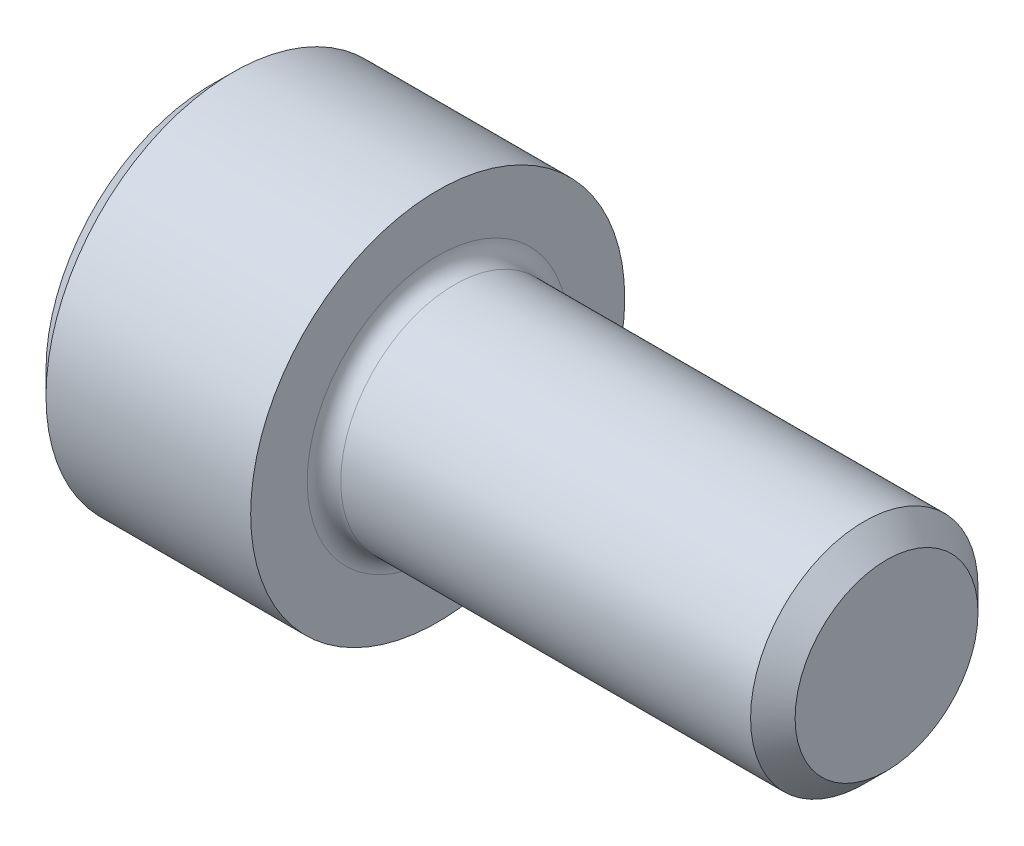
ISO-10303-21;
HEADER;
FILE_DESCRIPTION(('STEP AP214'),'2;1');
FILE_NAME('part.step','',(''),(''),'','','');
FILE_SCHEMA(('AUTOMOTIVE_DESIGN { 1 0 10303 214 1 1 1 1 }'));
ENDSEC;
DATA;
#1=APPLICATION_CONTEXT('core data for automotive mechanical design processes');
#2=APPLICATION_PROTOCOL_DEFINITION('international standard','automotive_design',2000,#1);
#3=PRODUCT_CONTEXT('',#1,'mechanical');
#4=PRODUCT('Part','Part','',(#3));
#5=PRODUCT_RELATED_PRODUCT_CATEGORY('part','',(#4));
#6=PRODUCT_DEFINITION_FORMATION('','',#4);
#7=PRODUCT_DEFINITION_CONTEXT('part definition',#1,'design');
#8=PRODUCT_DEFINITION('design','',#6,#7);
#9=PRODUCT_DEFINITION_SHAPE('','',#8);
#10=(LENGTH_UNIT() NAMED_UNIT(*) SI_UNIT(.MILLI.,.METRE.));
#11=(NAMED_UNIT(*) PLANE_ANGLE_UNIT() SI_UNIT($,.RADIAN.));
#12=(NAMED_UNIT(*) SI_UNIT($,.STERADIAN.) SOLID_ANGLE_UNIT());
#13=UNCERTAINTY_MEASURE_WITH_UNIT(LENGTH_MEASURE(1.E-05),#10,'distance_accuracy_value','');
#14=(GEOMETRIC_REPRESENTATION_CONTEXT(3) GLOBAL_UNCERTAINTY_ASSIGNED_CONTEXT((#13)) GLOBAL_UNIT_ASSIGNED_CONTEXT((#10,
#11,#12)) REPRESENTATION_CONTEXT('',''));
#15=CARTESIAN_POINT('',(0.,0.,0.));
#16=DIRECTION('',(0.,0.,1.));
#17=DIRECTION('',(1.,0.,0.));
#18=AXIS2_PLACEMENT_3D('',#15,#16,#17);
#19=CARTESIAN_POINT('',(0.,0.,0.));
#20=DIRECTION('',(-1.,0.,0.));
#21=DIRECTION('',(0.,0.,1.));
#22=AXIS2_PLACEMENT_3D('',#19,#20,#21);
#23=PLANE('',#22);
#24=DIRECTION('',(0.,-0.499999999999998,0.86602540378444));
#25=VECTOR('',#24,1.);
#26=CARTESIAN_POINT('',(0.,2.2920921156882,0.));
#27=LINE('',#26,#25);
#28=CARTESIAN_POINT('',(0.,2.2920921156882,0.));
#29=VERTEX_POINT('',#28);
#30=CARTESIAN_POINT('',(0.,1.14604605784411,1.98501));
#31=VERTEX_POINT('',#30);
#32=EDGE_CURVE('E264',#29,#31,#27,.T.);
#33=ORIENTED_EDGE('',*,*,#32,.T.);
#34=DIRECTION('',(0.,1.,0.));
#35=VECTOR('',#34,1.);
#36=CARTESIAN_POINT('',(0.,-1.14604605784409,1.98501));
#37=LINE('',#36,#35);
#38=CARTESIAN_POINT('',(0.,-1.14604605784409,1.98501));
#39=VERTEX_POINT('',#38);
#40=EDGE_CURVE('E124',#39,#31,#37,.T.);
#41=ORIENTED_EDGE('',*,*,#40,.F.);
#42=DIRECTION('',(0.,-0.500000000000001,-0.866025403784438));
#43=VECTOR('',#42,1.);
#44=CARTESIAN_POINT('',(0.,-1.14604605784409,1.98501));
#45=LINE('',#44,#43);
#46=CARTESIAN_POINT('',(0.,-2.29209211568819,0.));
#47=VERTEX_POINT('',#46);
#48=EDGE_CURVE('E267',#39,#47,#45,.T.);
#49=ORIENTED_EDGE('',*,*,#48,.T.);
#50=DIRECTION('',(0.,0.499999999999999,-0.86602540378444));
#51=VECTOR('',#50,1.);
#52=CARTESIAN_POINT('',(0.,-2.29209211568819,0.));
#53=LINE('',#52,#51);
#54=CARTESIAN_POINT('',(0.,-1.1460460578441,-1.98501));
#55=VERTEX_POINT('',#54);
#56=EDGE_CURVE('E270',#47,#55,#53,.T.);
#57=ORIENTED_EDGE('',*,*,#56,.T.);
#58=DIRECTION('',(0.,-1.,0.));
#59=VECTOR('',#58,1.);
#60=CARTESIAN_POINT('',(0.,1.1460460578441,-1.98501));
#61=LINE('',#60,#59);
#62=CARTESIAN_POINT('',(0.,1.1460460578441,-1.98501));
#63=VERTEX_POINT('',#62);
#64=EDGE_CURVE('E273',#63,#55,#61,.T.);
#65=ORIENTED_EDGE('',*,*,#64,.F.);
#66=DIRECTION('',(0.,-0.500000000000002,-0.866025403784438));
#67=VECTOR('',#66,1.);
#68=CARTESIAN_POINT('',(0.,2.2920921156882,0.));
#69=LINE('',#68,#67);
#70=EDGE_CURVE('E119',#29,#63,#69,.T.);
#71=ORIENTED_EDGE('',*,*,#70,.F.);
#72=EDGE_LOOP('',(#33,#41,#49,#57,#65,#71));
#73=FACE_BOUND('',#72,.T.);
#74=CARTESIAN_POINT('',(0.,0.,0.));
#75=DIRECTION('',(-1.,0.,0.));
#76=DIRECTION('',(0.,0.,1.));
#77=AXIS2_PLACEMENT_3D('',#74,#75,#76);
#78=CIRCLE('',#77,3.48615000000001);
#79=CARTESIAN_POINT('',(0.,0.,3.48615000000001));
#80=VERTEX_POINT('',#79);
#81=EDGE_CURVE('E148',#80,#80,#78,.T.);
#82=ORIENTED_EDGE('',*,*,#81,.T.);
#83=EDGE_LOOP('',(#82));
#84=FACE_BOUND('',#83,.T.);
#85=ADVANCED_FACE('F32',(#73,#84),#23,.T.);
#86=CARTESIAN_POINT('',(0.,0.,0.));
#87=DIRECTION('',(1.,0.,0.));
#88=DIRECTION('',(0.,0.,-1.));
#89=AXIS2_PLACEMENT_3D('',#86,#87,#88);
#90=CONICAL_SURFACE('',#89,3.48615000000001,0.785398163397439);
#91=CARTESIAN_POINT('',(0.4826,0.,0.));
#92=DIRECTION('',(-1.,0.,0.));
#93=DIRECTION('',(0.,0.,1.));
#94=AXIS2_PLACEMENT_3D('',#91,#92,#93);
#95=CIRCLE('',#94,3.96875);
#96=CARTESIAN_POINT('',(0.4826,0.,3.96875));
#97=VERTEX_POINT('',#96);
#98=EDGE_CURVE('E145',#97,#97,#95,.T.);
#99=ORIENTED_EDGE('',*,*,#98,.T.);
#100=EDGE_LOOP('',(#99));
#101=FACE_BOUND('',#100,.T.);
#102=ORIENTED_EDGE('',*,*,#81,.F.);
#103=EDGE_LOOP('',(#102));
#104=FACE_BOUND('',#103,.T.);
#105=ADVANCED_FACE('F169',(#101,#104),#90,.T.);
#106=CARTESIAN_POINT('',(-31.75,0.,0.));
#107=DIRECTION('',(-1.,0.,0.));
#108=DIRECTION('',(0.,0.,1.));
#109=AXIS2_PLACEMENT_3D('',#106,#107,#108);
#110=CYLINDRICAL_SURFACE('',#109,3.96875);
#111=CARTESIAN_POINT('',(4.826,0.,0.));
#112=DIRECTION('',(-1.,0.,0.));
#113=DIRECTION('',(0.,0.,1.));
#114=AXIS2_PLACEMENT_3D('',#111,#112,#113);
#115=CIRCLE('',#114,3.96875);
#116=CARTESIAN_POINT('',(4.826,0.,3.96875));
#117=VERTEX_POINT('',#116);
#118=EDGE_CURVE('E142',#117,#117,#115,.T.);
#119=ORIENTED_EDGE('',*,*,#118,.T.);
#120=EDGE_LOOP('',(#119));
#121=FACE_BOUND('',#120,.T.);
#122=ORIENTED_EDGE('',*,*,#98,.F.);
#123=EDGE_LOOP('',(#122));
#124=FACE_BOUND('',#123,.T.);
#125=ADVANCED_FACE('F174',(#121,#124),#110,.T.);
#126=CARTESIAN_POINT('',(4.826,3.96875,0.));
#127=DIRECTION('',(1.,0.,0.));
#128=DIRECTION('',(0.,0.,-1.));
#129=AXIS2_PLACEMENT_3D('',#126,#127,#128);
#130=PLANE('',#129);
#131=CARTESIAN_POINT('',(4.826,0.,0.));
#132=DIRECTION('',(1.,0.,0.));
#133=DIRECTION('',(0.,0.,-1.));
#134=AXIS2_PLACEMENT_3D('',#131,#132,#133);
#135=CIRCLE('',#134,2.7686);
#136=CARTESIAN_POINT('',(4.826,0.,-2.7686));
#137=VERTEX_POINT('',#136);
#138=EDGE_CURVE('E40',#137,#137,#135,.F.);
#139=ORIENTED_EDGE('',*,*,#138,.T.);
#140=EDGE_LOOP('',(#139));
#141=FACE_BOUND('',#140,.T.);
#142=ORIENTED_EDGE('',*,*,#118,.F.);
#143=EDGE_LOOP('',(#142));
#144=FACE_BOUND('',#143,.T.);
#145=ADVANCED_FACE('F153',(#141,#144),#130,.T.);
#146=CARTESIAN_POINT('',(-31.75,0.,0.));
#147=DIRECTION('',(-1.,0.,0.));
#148=DIRECTION('',(0.,0.,1.));
#149=AXIS2_PLACEMENT_3D('',#146,#147,#148);
#150=CYLINDRICAL_SURFACE('',#149,2.413);
#151=CARTESIAN_POINT('',(5.1816,0.,0.));
#152=DIRECTION('',(1.,0.,0.));
#153=DIRECTION('',(0.,0.,-1.));
#154=AXIS2_PLACEMENT_3D('',#151,#152,#153);
#155=CIRCLE('',#154,2.413);
#156=CARTESIAN_POINT('',(5.1816,0.,-2.413));
#157=VERTEX_POINT('',#156);
#158=EDGE_CURVE('E11',#157,#157,#155,.T.);
#159=ORIENTED_EDGE('',*,*,#158,.T.);
#160=EDGE_LOOP('',(#159));
#161=FACE_BOUND('',#160,.T.);
#162=CARTESIAN_POINT('',(13.87856,0.,0.));
#163=DIRECTION('',(-1.,0.,0.));
#164=DIRECTION('',(0.,0.,1.));
#165=AXIS2_PLACEMENT_3D('',#162,#163,#164);
#166=CIRCLE('',#165,2.413);
#167=CARTESIAN_POINT('',(13.87856,0.,2.413));
#168=VERTEX_POINT('',#167);
#169=EDGE_CURVE('E139',#168,#168,#166,.T.);
#170=ORIENTED_EDGE('',*,*,#169,.T.);
#171=EDGE_LOOP('',(#170));
#172=FACE_BOUND('',#171,.T.);
#173=ADVANCED_FACE('F184',(#161,#172),#150,.T.);
#174=CARTESIAN_POINT('',(14.351,0.,0.));
#175=DIRECTION('',(-1.,0.,0.));
#176=DIRECTION('',(0.,0.,1.));
#177=AXIS2_PLACEMENT_3D('',#174,#175,#176);
#178=CONICAL_SURFACE('',#177,1.94056,0.785398163397461);
#179=ORIENTED_EDGE('',*,*,#169,.F.);
#180=EDGE_LOOP('',(#179));
#181=FACE_BOUND('',#180,.T.);
#182=CARTESIAN_POINT('',(14.351,0.,0.));
#183=DIRECTION('',(-1.,0.,0.));
#184=DIRECTION('',(0.,0.,1.));
#185=AXIS2_PLACEMENT_3D('',#182,#183,#184);
#186=CIRCLE('',#185,1.94056);
#187=CARTESIAN_POINT('',(14.351,0.,1.94056));
#188=VERTEX_POINT('',#187);
#189=EDGE_CURVE('E135',#188,#188,#186,.T.);
#190=ORIENTED_EDGE('',*,*,#189,.T.);
#191=EDGE_LOOP('',(#190));
#192=FACE_BOUND('',#191,.T.);
#193=ADVANCED_FACE('F164',(#181,#192),#178,.T.);
#194=CARTESIAN_POINT('',(14.351,1.94056,0.));
#195=DIRECTION('',(1.,0.,0.));
#196=DIRECTION('',(0.,0.,-1.));
#197=AXIS2_PLACEMENT_3D('',#194,#195,#196);
#198=PLANE('',#197);
#199=ORIENTED_EDGE('',*,*,#189,.F.);
#200=EDGE_LOOP('',(#199));
#201=FACE_BOUND('',#200,.T.);
#202=ADVANCED_FACE('F157',(#201),#198,.T.);
#203=CARTESIAN_POINT('',(5.1816,0.,0.));
#204=DIRECTION('',(1.,0.,0.));
#205=DIRECTION('',(0.,0.,-1.));
#206=AXIS2_PLACEMENT_3D('',#203,#204,#205);
#207=TOROIDAL_SURFACE('',#206,2.7686,0.3556);
#208=ORIENTED_EDGE('',*,*,#158,.F.);
#209=EDGE_LOOP('',(#208));
#210=FACE_BOUND('',#209,.T.);
#211=ORIENTED_EDGE('',*,*,#138,.F.);
#212=EDGE_LOOP('',(#211));
#213=FACE_BOUND('',#212,.T.);
#214=ADVANCED_FACE('F34',(#210,#213),#207,.F.);
#215=CARTESIAN_POINT('',(2.286,2.2920921156882,0.));
#216=DIRECTION('',(0.,-0.866025403784439,-0.499999999999998));
#217=DIRECTION('',(0.,0.499999999999998,-0.86602540378444));
#218=AXIS2_PLACEMENT_3D('',#215,#216,#217);
#219=PLANE('',#218);
#220=ORIENTED_EDGE('',*,*,#32,.F.);
#221=DIRECTION('',(-1.,0.,0.));
#222=VECTOR('',#221,1.);
#223=CARTESIAN_POINT('',(2.286,2.2920921156882,0.));
#224=LINE('',#223,#222);
#225=CARTESIAN_POINT('',(2.286,2.2920921156882,0.));
#226=VERTEX_POINT('',#225);
#227=EDGE_CURVE('E263',#226,#29,#224,.T.);
#228=ORIENTED_EDGE('',*,*,#227,.F.);
#229=DIRECTION('',(0.,-0.499999999999998,0.86602540378444));
#230=VECTOR('',#229,1.);
#231=CARTESIAN_POINT('',(2.286,2.2920921156882,0.));
#232=LINE('',#231,#230);
#233=CARTESIAN_POINT('',(2.286,1.71906908676615,0.992504999999996));
#234=VERTEX_POINT('',#233);
#235=EDGE_CURVE('E47',#226,#234,#232,.T.);
#236=ORIENTED_EDGE('',*,*,#235,.T.);
#237=CARTESIAN_POINT('',(2.286,1.14604605784411,1.98501));
#238=VERTEX_POINT('',#237);
#239=EDGE_CURVE('E105',#234,#238,#232,.T.);
#240=ORIENTED_EDGE('',*,*,#239,.T.);
#241=DIRECTION('',(-1.,0.,0.));
#242=VECTOR('',#241,1.);
#243=CARTESIAN_POINT('',(2.286,1.14604605784411,1.98501));
#244=LINE('',#243,#242);
#245=EDGE_CURVE('E117',#238,#31,#244,.T.);
#246=ORIENTED_EDGE('',*,*,#245,.T.);
#247=EDGE_LOOP('',(#220,#228,#236,#240,#246));
#248=FACE_BOUND('',#247,.T.);
#249=ADVANCED_FACE('F116',(#248),#219,.T.);
#250=CARTESIAN_POINT('',(2.286,-1.14604605784409,1.98501));
#251=DIRECTION('',(0.,0.,1.));
#252=DIRECTION('',(0.,-1.,0.));
#253=AXIS2_PLACEMENT_3D('',#250,#251,#252);
#254=PLANE('',#253);
#255=ORIENTED_EDGE('',*,*,#40,.T.);
#256=ORIENTED_EDGE('',*,*,#245,.F.);
#257=DIRECTION('',(0.,1.,0.));
#258=VECTOR('',#257,1.);
#259=CARTESIAN_POINT('',(2.286,-1.14604605784409,1.98501));
#260=LINE('',#259,#258);
#261=CARTESIAN_POINT('',(2.286,0.,1.98501));
#262=VERTEX_POINT('',#261);
#263=EDGE_CURVE('E103',#262,#238,#260,.T.);
#264=ORIENTED_EDGE('',*,*,#263,.F.);
#265=CARTESIAN_POINT('',(2.286,-1.14604605784409,1.98501));
#266=VERTEX_POINT('',#265);
#267=EDGE_CURVE('E113',#266,#262,#260,.T.);
#268=ORIENTED_EDGE('',*,*,#267,.F.);
#269=DIRECTION('',(-1.,0.,0.));
#270=VECTOR('',#269,1.);
#271=CARTESIAN_POINT('',(2.286,-1.14604605784409,1.98501));
#272=LINE('',#271,#270);
#273=EDGE_CURVE('E126',#266,#39,#272,.T.);
#274=ORIENTED_EDGE('',*,*,#273,.T.);
#275=EDGE_LOOP('',(#255,#256,#264,#268,#274));
#276=FACE_BOUND('',#275,.T.);
#277=ADVANCED_FACE('F121',(#276),#254,.F.);
#278=CARTESIAN_POINT('',(2.286,-1.14604605784409,1.98501));
#279=DIRECTION('',(0.,0.866025403784438,-0.500000000000001));
#280=DIRECTION('',(0.,0.500000000000001,0.866025403784438));
#281=AXIS2_PLACEMENT_3D('',#278,#279,#280);
#282=PLANE('',#281);
#283=ORIENTED_EDGE('',*,*,#48,.F.);
#284=ORIENTED_EDGE('',*,*,#273,.F.);
#285=DIRECTION('',(0.,-0.500000000000001,-0.866025403784438));
#286=VECTOR('',#285,1.);
#287=CARTESIAN_POINT('',(2.286,-1.14604605784409,1.98501));
#288=LINE('',#287,#286);
#289=CARTESIAN_POINT('',(2.286,-1.71906908676614,0.992505));
#290=VERTEX_POINT('',#289);
#291=EDGE_CURVE('E244',#266,#290,#288,.T.);
#292=ORIENTED_EDGE('',*,*,#291,.T.);
#293=CARTESIAN_POINT('',(2.286,-2.29209211568819,0.));
#294=VERTEX_POINT('',#293);
#295=EDGE_CURVE('E246',#290,#294,#288,.T.);
#296=ORIENTED_EDGE('',*,*,#295,.T.);
#297=DIRECTION('',(-1.,0.,0.));
#298=VECTOR('',#297,1.);
#299=CARTESIAN_POINT('',(2.286,-2.29209211568819,0.));
#300=LINE('',#299,#298);
#301=EDGE_CURVE('E131',#294,#47,#300,.T.);
#302=ORIENTED_EDGE('',*,*,#301,.T.);
#303=EDGE_LOOP('',(#283,#284,#292,#296,#302));
#304=FACE_BOUND('',#303,.T.);
#305=ADVANCED_FACE('F196',(#304),#282,.T.);
#306=CARTESIAN_POINT('',(2.286,-2.29209211568819,0.));
#307=DIRECTION('',(0.,0.866025403784439,0.499999999999999));
#308=DIRECTION('',(0.,-0.499999999999999,0.866025403784439));
#309=AXIS2_PLACEMENT_3D('',#306,#307,#308);
#310=PLANE('',#309);
#311=ORIENTED_EDGE('',*,*,#56,.F.);
#312=ORIENTED_EDGE('',*,*,#301,.F.);
#313=DIRECTION('',(0.,0.499999999999999,-0.86602540378444));
#314=VECTOR('',#313,1.);
#315=CARTESIAN_POINT('',(2.286,-2.29209211568819,0.));
#316=LINE('',#315,#314);
#317=CARTESIAN_POINT('',(2.286,-1.71906908676615,-0.992504999999996));
#318=VERTEX_POINT('',#317);
#319=EDGE_CURVE('E249',#294,#318,#316,.T.);
#320=ORIENTED_EDGE('',*,*,#319,.T.);
#321=CARTESIAN_POINT('',(2.286,-1.1460460578441,-1.98501));
#322=VERTEX_POINT('',#321);
#323=EDGE_CURVE('E253',#318,#322,#316,.T.);
#324=ORIENTED_EDGE('',*,*,#323,.T.);
#325=DIRECTION('',(-1.,0.,0.));
#326=VECTOR('',#325,1.);
#327=CARTESIAN_POINT('',(2.286,-1.1460460578441,-1.98501));
#328=LINE('',#327,#326);
#329=EDGE_CURVE('E282',#322,#55,#328,.T.);
#330=ORIENTED_EDGE('',*,*,#329,.T.);
#331=EDGE_LOOP('',(#311,#312,#320,#324,#330));
#332=FACE_BOUND('',#331,.T.);
#333=ADVANCED_FACE('F199',(#332),#310,.T.);
#334=CARTESIAN_POINT('',(2.286,1.1460460578441,-1.98501));
#335=DIRECTION('',(0.,0.,-1.));
#336=DIRECTION('',(0.,1.,0.));
#337=AXIS2_PLACEMENT_3D('',#334,#335,#336);
#338=PLANE('',#337);
#339=ORIENTED_EDGE('',*,*,#64,.T.);
#340=ORIENTED_EDGE('',*,*,#329,.F.);
#341=DIRECTION('',(0.,-1.,0.));
#342=VECTOR('',#341,1.);
#343=CARTESIAN_POINT('',(2.286,1.1460460578441,-1.98501));
#344=LINE('',#343,#342);
#345=CARTESIAN_POINT('',(2.286,0.,-1.98501));
#346=VERTEX_POINT('',#345);
#347=EDGE_CURVE('E257',#346,#322,#344,.T.);
#348=ORIENTED_EDGE('',*,*,#347,.F.);
#349=CARTESIAN_POINT('',(2.286,1.1460460578441,-1.98501));
#350=VERTEX_POINT('',#349);
#351=EDGE_CURVE('E258',#350,#346,#344,.T.);
#352=ORIENTED_EDGE('',*,*,#351,.F.);
#353=DIRECTION('',(-1.,0.,0.));
#354=VECTOR('',#353,1.);
#355=CARTESIAN_POINT('',(2.286,1.1460460578441,-1.98501));
#356=LINE('',#355,#354);
#357=EDGE_CURVE('E279',#350,#63,#356,.T.);
#358=ORIENTED_EDGE('',*,*,#357,.T.);
#359=EDGE_LOOP('',(#339,#340,#348,#352,#358));
#360=FACE_BOUND('',#359,.T.);
#361=ADVANCED_FACE('F203',(#360),#338,.F.);
#362=CARTESIAN_POINT('',(2.286,2.2920921156882,0.));
#363=DIRECTION('',(0.,0.866025403784438,-0.500000000000002));
#364=DIRECTION('',(0.,0.500000000000002,0.866025403784438));
#365=AXIS2_PLACEMENT_3D('',#362,#363,#364);
#366=PLANE('',#365);
#367=ORIENTED_EDGE('',*,*,#70,.T.);
#368=ORIENTED_EDGE('',*,*,#357,.F.);
#369=DIRECTION('',(0.,-0.500000000000002,-0.866025403784438));
#370=VECTOR('',#369,1.);
#371=CARTESIAN_POINT('',(2.286,2.2920921156882,0.));
#372=LINE('',#371,#370);
#373=CARTESIAN_POINT('',(2.286,1.71906908676615,-0.992505000000006));
#374=VERTEX_POINT('',#373);
#375=EDGE_CURVE('E261',#374,#350,#372,.T.);
#376=ORIENTED_EDGE('',*,*,#375,.F.);
#377=EDGE_CURVE('E235',#226,#374,#372,.T.);
#378=ORIENTED_EDGE('',*,*,#377,.F.);
#379=ORIENTED_EDGE('',*,*,#227,.T.);
#380=EDGE_LOOP('',(#367,#368,#376,#378,#379));
#381=FACE_BOUND('',#380,.T.);
#382=ADVANCED_FACE('F207',(#381),#366,.F.);
#383=CARTESIAN_POINT('',(2.286,1.14604605784411,1.98501));
#384=DIRECTION('',(-1.,0.,0.));
#385=DIRECTION('',(0.,0.,1.));
#386=AXIS2_PLACEMENT_3D('',#383,#384,#385);
#387=PLANE('',#386);
#388=CARTESIAN_POINT('',(2.286,0.,0.));
#389=DIRECTION('',(-1.,0.,0.));
#390=DIRECTION('',(0.,0.,1.));
#391=AXIS2_PLACEMENT_3D('',#388,#389,#390);
#392=CIRCLE('',#391,1.98501);
#393=EDGE_CURVE('E125',#290,#262,#392,.T.);
#394=ORIENTED_EDGE('',*,*,#393,.F.);
#395=ORIENTED_EDGE('',*,*,#291,.F.);
#396=ORIENTED_EDGE('',*,*,#267,.T.);
#397=EDGE_LOOP('',(#394,#395,#396));
#398=FACE_BOUND('',#397,.T.);
#399=ADVANCED_FACE('F211',(#398),#387,.T.);
#400=EDGE_CURVE('E129',#318,#290,#392,.T.);
#401=ORIENTED_EDGE('',*,*,#400,.F.);
#402=ORIENTED_EDGE('',*,*,#319,.F.);
#403=ORIENTED_EDGE('',*,*,#295,.F.);
#404=EDGE_LOOP('',(#401,#402,#403));
#405=FACE_BOUND('',#404,.T.);
#406=ADVANCED_FACE('F214',(#405),#387,.T.);
#407=EDGE_CURVE('E288',#346,#318,#392,.T.);
#408=ORIENTED_EDGE('',*,*,#407,.F.);
#409=ORIENTED_EDGE('',*,*,#347,.T.);
#410=ORIENTED_EDGE('',*,*,#323,.F.);
#411=EDGE_LOOP('',(#408,#409,#410));
#412=FACE_BOUND('',#411,.T.);
#413=ADVANCED_FACE('F219',(#412),#387,.T.);
#414=EDGE_CURVE('E238',#374,#346,#392,.T.);
#415=ORIENTED_EDGE('',*,*,#414,.F.);
#416=ORIENTED_EDGE('',*,*,#375,.T.);
#417=ORIENTED_EDGE('',*,*,#351,.T.);
#418=EDGE_LOOP('',(#415,#416,#417));
#419=FACE_BOUND('',#418,.T.);
#420=ADVANCED_FACE('F226',(#419),#387,.T.);
#421=EDGE_CURVE('E136',#234,#374,#392,.T.);
#422=ORIENTED_EDGE('',*,*,#421,.F.);
#423=ORIENTED_EDGE('',*,*,#235,.F.);
#424=ORIENTED_EDGE('',*,*,#377,.T.);
#425=EDGE_LOOP('',(#422,#423,#424));
#426=FACE_BOUND('',#425,.T.);
#427=ADVANCED_FACE('F222',(#426),#387,.T.);
#428=EDGE_CURVE('E108',#262,#234,#392,.T.);
#429=ORIENTED_EDGE('',*,*,#428,.F.);
#430=ORIENTED_EDGE('',*,*,#263,.T.);
#431=ORIENTED_EDGE('',*,*,#239,.F.);
#432=EDGE_LOOP('',(#429,#430,#431));
#433=FACE_BOUND('',#432,.T.);
#434=ADVANCED_FACE('F104',(#433),#387,.T.);
#435=CARTESIAN_POINT('',(2.286,0.,0.));
#436=DIRECTION('',(-1.,0.,0.));
#437=DIRECTION('',(0.,0.,1.));
#438=AXIS2_PLACEMENT_3D('',#435,#436,#437);
#439=CONICAL_SURFACE('',#438,1.98501,1.04719755119659);
#440=CARTESIAN_POINT('',(3.43204605784411,0.,0.));
#441=VERTEX_POINT('',#440);
#442=VERTEX_LOOP('',#441);
#443=FACE_BOUND('',#442,.T.);
#444=ORIENTED_EDGE('',*,*,#428,.T.);
#445=ORIENTED_EDGE('',*,*,#421,.T.);
#446=ORIENTED_EDGE('',*,*,#414,.T.);
#447=ORIENTED_EDGE('',*,*,#407,.T.);
#448=ORIENTED_EDGE('',*,*,#400,.T.);
#449=ORIENTED_EDGE('',*,*,#393,.T.);
#450=EDGE_LOOP('',(#444,#445,#446,#447,#448,#449));
#451=FACE_BOUND('',#450,.T.);
#452=ADVANCED_FACE('F191',(#443,#451),#439,.F.);
#453=CLOSED_SHELL('',(#85,#105,#125,#145,#173,#193,#202,#214,#249,#277,#305,#333,#361,#382,#399,
#406,#413,#420,#427,#434,#452));
#454=MANIFOLD_SOLID_BREP('B2',#453);
#455=ADVANCED_BREP_SHAPE_REPRESENTATION('',(#18,#454),#14);
#456=SHAPE_DEFINITION_REPRESENTATION(#9,#455);
ENDSEC;
END-ISO-10303-21;
